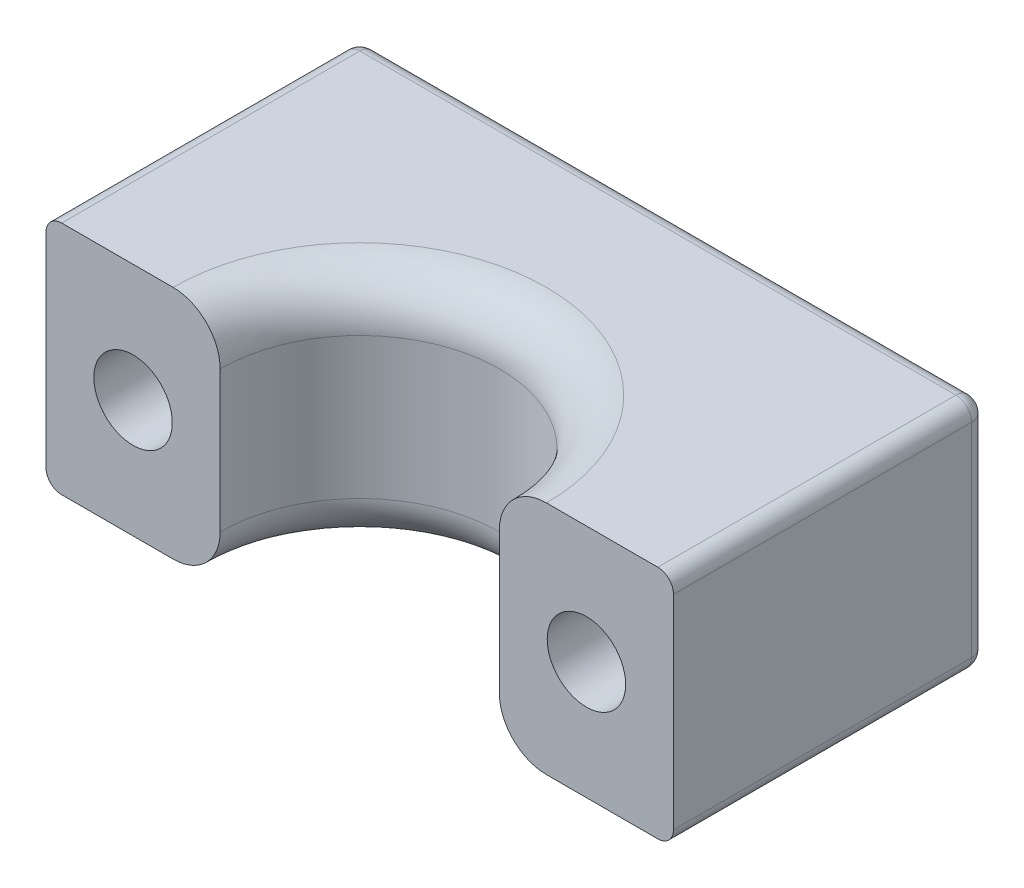
ISO-10303-21;
HEADER;
FILE_DESCRIPTION(('STEP AP214'),'2;1');
FILE_NAME('part.step','',(''),(''),'','','');
FILE_SCHEMA(('AUTOMOTIVE_DESIGN { 1 0 10303 214 1 1 1 1 }'));
ENDSEC;
DATA;
#1=APPLICATION_CONTEXT('core data for automotive mechanical design processes');
#2=APPLICATION_PROTOCOL_DEFINITION('international standard','automotive_design',2000,#1);
#3=PRODUCT_CONTEXT('',#1,'mechanical');
#4=PRODUCT('Part','Part','',(#3));
#5=PRODUCT_RELATED_PRODUCT_CATEGORY('part','',(#4));
#6=PRODUCT_DEFINITION_FORMATION('','',#4);
#7=PRODUCT_DEFINITION_CONTEXT('part definition',#1,'design');
#8=PRODUCT_DEFINITION('design','',#6,#7);
#9=PRODUCT_DEFINITION_SHAPE('','',#8);
#10=(LENGTH_UNIT() NAMED_UNIT(*) SI_UNIT(.MILLI.,.METRE.));
#11=(NAMED_UNIT(*) PLANE_ANGLE_UNIT() SI_UNIT($,.RADIAN.));
#12=(NAMED_UNIT(*) SI_UNIT($,.STERADIAN.) SOLID_ANGLE_UNIT());
#13=UNCERTAINTY_MEASURE_WITH_UNIT(LENGTH_MEASURE(1.E-05),#10,'distance_accuracy_value','');
#14=(GEOMETRIC_REPRESENTATION_CONTEXT(3) GLOBAL_UNCERTAINTY_ASSIGNED_CONTEXT((#13)) GLOBAL_UNIT_ASSIGNED_CONTEXT((#10,
#11,#12)) REPRESENTATION_CONTEXT('',''));
#15=CARTESIAN_POINT('',(0.,0.,0.));
#16=DIRECTION('',(0.,0.,1.));
#17=DIRECTION('',(1.,0.,0.));
#18=AXIS2_PLACEMENT_3D('',#15,#16,#17);
#19=CARTESIAN_POINT('',(0.,15.,0.));
#20=DIRECTION('',(1.,0.,0.));
#21=DIRECTION('',(0.,0.,-1.));
#22=AXIS2_PLACEMENT_3D('',#19,#20,#21);
#23=PLANE('',#22);
#24=DIRECTION('',(0.,-1.,0.));
#25=VECTOR('',#24,1.);
#26=CARTESIAN_POINT('',(0.,15.,-39.));
#27=LINE('',#26,#25);
#28=CARTESIAN_POINT('',(0.,14.,-39.));
#29=VERTEX_POINT('',#28);
#30=CARTESIAN_POINT('',(0.,1.,-39.));
#31=VERTEX_POINT('',#30);
#32=EDGE_CURVE('E237',#29,#31,#27,.T.);
#33=ORIENTED_EDGE('',*,*,#32,.T.);
#34=DIRECTION('',(0.,0.,1.));
#35=VECTOR('',#34,1.);
#36=CARTESIAN_POINT('',(0.,1.,-20.));
#37=LINE('',#36,#35);
#38=CARTESIAN_POINT('',(0.,1.,-20.));
#39=VERTEX_POINT('',#38);
#40=EDGE_CURVE('E240',#31,#39,#37,.T.);
#41=ORIENTED_EDGE('',*,*,#40,.T.);
#42=DIRECTION('',(0.,1.,0.));
#43=VECTOR('',#42,1.);
#44=CARTESIAN_POINT('',(0.,0.,-20.));
#45=LINE('',#44,#43);
#46=CARTESIAN_POINT('',(0.,14.,-20.));
#47=VERTEX_POINT('',#46);
#48=EDGE_CURVE('E167',#39,#47,#45,.T.);
#49=ORIENTED_EDGE('',*,*,#48,.T.);
#50=DIRECTION('',(0.,0.,1.));
#51=VECTOR('',#50,1.);
#52=CARTESIAN_POINT('',(0.,14.,0.));
#53=LINE('',#52,#51);
#54=EDGE_CURVE('E209',#47,#29,#53,.F.);
#55=ORIENTED_EDGE('',*,*,#54,.T.);
#56=EDGE_LOOP('',(#33,#41,#49,#55));
#57=FACE_BOUND('',#56,.T.);
#58=ADVANCED_FACE('F35',(#57),#23,.F.);
#59=CARTESIAN_POINT('',(40.,15.,0.));
#60=DIRECTION('',(-1.,0.,0.));
#61=DIRECTION('',(0.,0.,1.));
#62=AXIS2_PLACEMENT_3D('',#59,#60,#61);
#63=PLANE('',#62);
#64=DIRECTION('',(0.,1.,0.));
#65=VECTOR('',#64,1.);
#66=CARTESIAN_POINT('',(40.,0.,-20.));
#67=LINE('',#66,#65);
#68=CARTESIAN_POINT('',(40.,1.,-20.));
#69=VERTEX_POINT('',#68);
#70=CARTESIAN_POINT('',(40.,14.,-20.));
#71=VERTEX_POINT('',#70);
#72=EDGE_CURVE('E163',#69,#71,#67,.T.);
#73=ORIENTED_EDGE('',*,*,#72,.F.);
#74=DIRECTION('',(0.,0.,-1.));
#75=VECTOR('',#74,1.);
#76=CARTESIAN_POINT('',(40.,1.,-39.));
#77=LINE('',#76,#75);
#78=CARTESIAN_POINT('',(40.,1.,-39.));
#79=VERTEX_POINT('',#78);
#80=EDGE_CURVE('E44',#69,#79,#77,.T.);
#81=ORIENTED_EDGE('',*,*,#80,.T.);
#82=DIRECTION('',(0.,-1.,0.));
#83=VECTOR('',#82,1.);
#84=CARTESIAN_POINT('',(40.,15.,-39.));
#85=LINE('',#84,#83);
#86=CARTESIAN_POINT('',(40.,14.,-39.));
#87=VERTEX_POINT('',#86);
#88=EDGE_CURVE('E235',#79,#87,#85,.F.);
#89=ORIENTED_EDGE('',*,*,#88,.T.);
#90=DIRECTION('',(0.,0.,-1.));
#91=VECTOR('',#90,1.);
#92=CARTESIAN_POINT('',(40.,14.,0.));
#93=LINE('',#92,#91);
#94=EDGE_CURVE('E212',#87,#71,#93,.F.);
#95=ORIENTED_EDGE('',*,*,#94,.T.);
#96=EDGE_LOOP('',(#73,#81,#89,#95));
#97=FACE_BOUND('',#96,.T.);
#98=ADVANCED_FACE('F335',(#97),#63,.F.);
#99=CARTESIAN_POINT('',(0.,15.,-40.));
#100=DIRECTION('',(0.,0.,1.));
#101=DIRECTION('',(1.,0.,0.));
#102=AXIS2_PLACEMENT_3D('',#99,#100,#101);
#103=PLANE('',#102);
#104=CARTESIAN_POINT('',(34.45,7.5,-40.));
#105=DIRECTION('',(0.,0.,1.));
#106=DIRECTION('',(1.,0.,0.));
#107=AXIS2_PLACEMENT_3D('',#104,#105,#106);
#108=CIRCLE('',#107,2.5);
#109=CARTESIAN_POINT('',(36.95,7.5,-40.));
#110=VERTEX_POINT('',#109);
#111=EDGE_CURVE('E156',#110,#110,#108,.T.);
#112=ORIENTED_EDGE('',*,*,#111,.T.);
#113=EDGE_LOOP('',(#112));
#114=FACE_BOUND('',#113,.T.);
#115=CARTESIAN_POINT('',(5.55,7.5,-40.));
#116=DIRECTION('',(0.,0.,1.));
#117=DIRECTION('',(-1.,0.,0.));
#118=AXIS2_PLACEMENT_3D('',#115,#116,#117);
#119=CIRCLE('',#118,2.5);
#120=CARTESIAN_POINT('',(3.05,7.5,-40.));
#121=VERTEX_POINT('',#120);
#122=EDGE_CURVE('E179',#121,#121,#119,.T.);
#123=ORIENTED_EDGE('',*,*,#122,.T.);
#124=EDGE_LOOP('',(#123));
#125=FACE_BOUND('',#124,.T.);
#126=DIRECTION('',(0.,-1.,0.));
#127=VECTOR('',#126,1.);
#128=CARTESIAN_POINT('',(39.,15.,-40.));
#129=LINE('',#128,#127);
#130=CARTESIAN_POINT('',(39.,14.,-40.));
#131=VERTEX_POINT('',#130);
#132=CARTESIAN_POINT('',(39.,1.,-40.));
#133=VERTEX_POINT('',#132);
#134=EDGE_CURVE('E232',#131,#133,#129,.T.);
#135=ORIENTED_EDGE('',*,*,#134,.T.);
#136=DIRECTION('',(-1.,0.,0.));
#137=VECTOR('',#136,1.);
#138=CARTESIAN_POINT('',(1.,1.,-40.));
#139=LINE('',#138,#137);
#140=CARTESIAN_POINT('',(1.,1.,-40.));
#141=VERTEX_POINT('',#140);
#142=EDGE_CURVE('E256',#133,#141,#139,.T.);
#143=ORIENTED_EDGE('',*,*,#142,.T.);
#144=DIRECTION('',(0.,-1.,0.));
#145=VECTOR('',#144,1.);
#146=CARTESIAN_POINT('',(1.,15.,-40.));
#147=LINE('',#146,#145);
#148=CARTESIAN_POINT('',(1.,14.,-40.));
#149=VERTEX_POINT('',#148);
#150=EDGE_CURVE('E230',#141,#149,#147,.F.);
#151=ORIENTED_EDGE('',*,*,#150,.T.);
#152=DIRECTION('',(-1.,0.,0.));
#153=VECTOR('',#152,1.);
#154=CARTESIAN_POINT('',(0.,14.,-40.));
#155=LINE('',#154,#153);
#156=EDGE_CURVE('E217',#149,#131,#155,.F.);
#157=ORIENTED_EDGE('',*,*,#156,.T.);
#158=EDGE_LOOP('',(#135,#143,#151,#157));
#159=FACE_BOUND('',#158,.T.);
#160=ADVANCED_FACE('F318',(#114,#125,#159),#103,.F.);
#161=CARTESIAN_POINT('',(0.,15.,0.));
#162=DIRECTION('',(0.,-1.,0.));
#163=DIRECTION('',(0.,0.,-1.));
#164=AXIS2_PLACEMENT_3D('',#161,#162,#163);
#165=PLANE('',#164);
#166=DIRECTION('',(-1.,0.,0.));
#167=VECTOR('',#166,1.);
#168=CARTESIAN_POINT('',(0.,15.,-39.));
#169=LINE('',#168,#167);
#170=CARTESIAN_POINT('',(39.,15.,-39.));
#171=VERTEX_POINT('',#170);
#172=CARTESIAN_POINT('',(1.,15.,-39.));
#173=VERTEX_POINT('',#172);
#174=EDGE_CURVE('E197',#171,#173,#169,.T.);
#175=ORIENTED_EDGE('',*,*,#174,.T.);
#176=DIRECTION('',(0.,0.,1.));
#177=VECTOR('',#176,1.);
#178=CARTESIAN_POINT('',(1.,15.,0.));
#179=LINE('',#178,#177);
#180=CARTESIAN_POINT('',(1.,15.,-20.));
#181=VERTEX_POINT('',#180);
#182=EDGE_CURVE('E203',#173,#181,#179,.T.);
#183=ORIENTED_EDGE('',*,*,#182,.T.);
#184=DIRECTION('',(-1.,0.,0.));
#185=VECTOR('',#184,1.);
#186=CARTESIAN_POINT('',(0.,15.,-20.));
#187=LINE('',#186,#185);
#188=CARTESIAN_POINT('',(8.1,15.,-20.));
#189=VERTEX_POINT('',#188);
#190=EDGE_CURVE('E164',#189,#181,#187,.T.);
#191=ORIENTED_EDGE('',*,*,#190,.F.);
#192=CARTESIAN_POINT('',(20.,15.,-20.));
#193=DIRECTION('',(0.,-1.,0.));
#194=DIRECTION('',(0.,0.,-1.));
#195=AXIS2_PLACEMENT_3D('',#192,#193,#194);
#196=CIRCLE('',#195,11.9);
#197=CARTESIAN_POINT('',(31.9,15.,-20.));
#198=VERTEX_POINT('',#197);
#199=EDGE_CURVE('E194',#189,#198,#196,.T.);
#200=ORIENTED_EDGE('',*,*,#199,.T.);
#201=CARTESIAN_POINT('',(39.,15.,-20.));
#202=VERTEX_POINT('',#201);
#203=EDGE_CURVE('E161',#202,#198,#187,.T.);
#204=ORIENTED_EDGE('',*,*,#203,.F.);
#205=DIRECTION('',(0.,0.,-1.));
#206=VECTOR('',#205,1.);
#207=CARTESIAN_POINT('',(39.,15.,0.));
#208=LINE('',#207,#206);
#209=EDGE_CURVE('E200',#202,#171,#208,.T.);
#210=ORIENTED_EDGE('',*,*,#209,.T.);
#211=EDGE_LOOP('',(#175,#183,#191,#200,#204,#210));
#212=FACE_BOUND('',#211,.T.);
#213=ADVANCED_FACE('F291',(#212),#165,.F.);
#214=CARTESIAN_POINT('',(0.,0.,0.));
#215=DIRECTION('',(0.,-1.,0.));
#216=DIRECTION('',(0.,0.,-1.));
#217=AXIS2_PLACEMENT_3D('',#214,#215,#216);
#218=PLANE('',#217);
#219=DIRECTION('',(-1.,0.,0.));
#220=VECTOR('',#219,1.);
#221=CARTESIAN_POINT('',(0.,0.,-20.));
#222=LINE('',#221,#220);
#223=CARTESIAN_POINT('',(8.1,0.,-20.));
#224=VERTEX_POINT('',#223);
#225=CARTESIAN_POINT('',(1.,0.,-20.));
#226=VERTEX_POINT('',#225);
#227=EDGE_CURVE('E152',#224,#226,#222,.T.);
#228=ORIENTED_EDGE('',*,*,#227,.T.);
#229=DIRECTION('',(0.,0.,1.));
#230=VECTOR('',#229,1.);
#231=CARTESIAN_POINT('',(1.,0.,-39.));
#232=LINE('',#231,#230);
#233=CARTESIAN_POINT('',(1.,0.,-39.));
#234=VERTEX_POINT('',#233);
#235=EDGE_CURVE('E252',#226,#234,#232,.F.);
#236=ORIENTED_EDGE('',*,*,#235,.T.);
#237=DIRECTION('',(-1.,0.,0.));
#238=VECTOR('',#237,1.);
#239=CARTESIAN_POINT('',(39.,0.,-39.));
#240=LINE('',#239,#238);
#241=CARTESIAN_POINT('',(39.,0.,-39.));
#242=VERTEX_POINT('',#241);
#243=EDGE_CURVE('E250',#234,#242,#240,.F.);
#244=ORIENTED_EDGE('',*,*,#243,.T.);
#245=DIRECTION('',(0.,0.,-1.));
#246=VECTOR('',#245,1.);
#247=CARTESIAN_POINT('',(39.,0.,-20.));
#248=LINE('',#247,#246);
#249=CARTESIAN_POINT('',(39.,0.,-20.));
#250=VERTEX_POINT('',#249);
#251=EDGE_CURVE('E248',#242,#250,#248,.F.);
#252=ORIENTED_EDGE('',*,*,#251,.T.);
#253=CARTESIAN_POINT('',(31.9,0.,-20.));
#254=VERTEX_POINT('',#253);
#255=EDGE_CURVE('E154',#250,#254,#222,.T.);
#256=ORIENTED_EDGE('',*,*,#255,.T.);
#257=CARTESIAN_POINT('',(20.,0.,-20.));
#258=DIRECTION('',(0.,-1.,0.));
#259=DIRECTION('',(0.,0.,-1.));
#260=AXIS2_PLACEMENT_3D('',#257,#258,#259);
#261=CIRCLE('',#260,11.9);
#262=EDGE_CURVE('E140',#254,#224,#261,.F.);
#263=ORIENTED_EDGE('',*,*,#262,.T.);
#264=EDGE_LOOP('',(#228,#236,#244,#252,#256,#263));
#265=FACE_BOUND('',#264,.T.);
#266=ADVANCED_FACE('F151',(#265),#218,.T.);
#267=CARTESIAN_POINT('',(20.,0.,-20.));
#268=DIRECTION('',(0.,1.,0.));
#269=DIRECTION('',(0.,0.,1.));
#270=AXIS2_PLACEMENT_3D('',#267,#268,#269);
#271=CYLINDRICAL_SURFACE('',#270,8.9);
#272=DIRECTION('',(0.,1.,0.));
#273=VECTOR('',#272,1.);
#274=CARTESIAN_POINT('',(11.1,0.,-20.));
#275=LINE('',#274,#273);
#276=CARTESIAN_POINT('',(11.1,12.,-20.));
#277=VERTEX_POINT('',#276);
#278=CARTESIAN_POINT('',(11.1,3.,-20.));
#279=VERTEX_POINT('',#278);
#280=EDGE_CURVE('E177',#277,#279,#275,.F.);
#281=ORIENTED_EDGE('',*,*,#280,.T.);
#282=CARTESIAN_POINT('',(20.,3.,-20.));
#283=DIRECTION('',(0.,-1.,0.));
#284=DIRECTION('',(0.,0.,-1.));
#285=AXIS2_PLACEMENT_3D('',#282,#283,#284);
#286=CIRCLE('',#285,8.9);
#287=CARTESIAN_POINT('',(28.9,3.,-20.));
#288=VERTEX_POINT('',#287);
#289=EDGE_CURVE('E141',#279,#288,#286,.T.);
#290=ORIENTED_EDGE('',*,*,#289,.T.);
#291=DIRECTION('',(0.,1.,0.));
#292=VECTOR('',#291,1.);
#293=CARTESIAN_POINT('',(28.9,0.,-20.));
#294=LINE('',#293,#292);
#295=CARTESIAN_POINT('',(28.9,12.,-20.));
#296=VERTEX_POINT('',#295);
#297=EDGE_CURVE('E174',#288,#296,#294,.T.);
#298=ORIENTED_EDGE('',*,*,#297,.T.);
#299=CARTESIAN_POINT('',(20.,12.,-20.));
#300=DIRECTION('',(0.,-1.,0.));
#301=DIRECTION('',(0.,0.,-1.));
#302=AXIS2_PLACEMENT_3D('',#299,#300,#301);
#303=CIRCLE('',#302,8.9);
#304=EDGE_CURVE('E146',#296,#277,#303,.F.);
#305=ORIENTED_EDGE('',*,*,#304,.T.);
#306=EDGE_LOOP('',(#281,#290,#298,#305));
#307=FACE_BOUND('',#306,.T.);
#308=ADVANCED_FACE('F284',(#307),#271,.F.);
#309=CARTESIAN_POINT('',(5.55,7.5,-40.));
#310=DIRECTION('',(0.,0.,1.));
#311=DIRECTION('',(1.,0.,0.));
#312=AXIS2_PLACEMENT_3D('',#309,#310,#311);
#313=CYLINDRICAL_SURFACE('',#312,2.5);
#314=CARTESIAN_POINT('',(5.55,7.5,-20.));
#315=DIRECTION('',(0.,0.,-1.));
#316=DIRECTION('',(-1.,0.,0.));
#317=AXIS2_PLACEMENT_3D('',#314,#315,#316);
#318=CIRCLE('',#317,2.5);
#319=CARTESIAN_POINT('',(3.05,7.5,-20.));
#320=VERTEX_POINT('',#319);
#321=EDGE_CURVE('E171',#320,#320,#318,.F.);
#322=ORIENTED_EDGE('',*,*,#321,.T.);
#323=EDGE_LOOP('',(#322));
#324=FACE_BOUND('',#323,.T.);
#325=ORIENTED_EDGE('',*,*,#122,.F.);
#326=EDGE_LOOP('',(#325));
#327=FACE_BOUND('',#326,.T.);
#328=ADVANCED_FACE('F436',(#324,#327),#313,.F.);
#329=CARTESIAN_POINT('',(34.45,7.5,-40.));
#330=DIRECTION('',(0.,0.,1.));
#331=DIRECTION('',(1.,0.,0.));
#332=AXIS2_PLACEMENT_3D('',#329,#330,#331);
#333=CYLINDRICAL_SURFACE('',#332,2.5);
#334=CARTESIAN_POINT('',(34.45,7.5,-20.));
#335=DIRECTION('',(0.,0.,-1.));
#336=DIRECTION('',(-1.,0.,0.));
#337=AXIS2_PLACEMENT_3D('',#334,#335,#336);
#338=CIRCLE('',#337,2.5);
#339=CARTESIAN_POINT('',(31.95,7.5,-20.));
#340=VERTEX_POINT('',#339);
#341=EDGE_CURVE('E169',#340,#340,#338,.F.);
#342=ORIENTED_EDGE('',*,*,#341,.T.);
#343=EDGE_LOOP('',(#342));
#344=FACE_BOUND('',#343,.T.);
#345=ORIENTED_EDGE('',*,*,#111,.F.);
#346=EDGE_LOOP('',(#345));
#347=FACE_BOUND('',#346,.T.);
#348=ADVANCED_FACE('F428',(#344,#347),#333,.F.);
#349=CARTESIAN_POINT('',(0.,0.,-20.));
#350=DIRECTION('',(0.,0.,-1.));
#351=DIRECTION('',(-1.,0.,0.));
#352=AXIS2_PLACEMENT_3D('',#349,#350,#351);
#353=PLANE('',#352);
#354=ORIENTED_EDGE('',*,*,#341,.F.);
#355=EDGE_LOOP('',(#354));
#356=FACE_BOUND('',#355,.T.);
#357=ORIENTED_EDGE('',*,*,#255,.F.);
#358=CARTESIAN_POINT('',(39.,1.,-20.));
#359=DIRECTION('',(0.,0.,-1.));
#360=DIRECTION('',(-1.,0.,0.));
#361=AXIS2_PLACEMENT_3D('',#358,#359,#360);
#362=CIRCLE('',#361,1.);
#363=EDGE_CURVE('E11',#250,#69,#362,.F.);
#364=ORIENTED_EDGE('',*,*,#363,.T.);
#365=ORIENTED_EDGE('',*,*,#72,.T.);
#366=CARTESIAN_POINT('',(39.,14.,-20.));
#367=DIRECTION('',(0.,0.,-1.));
#368=DIRECTION('',(-1.,0.,0.));
#369=AXIS2_PLACEMENT_3D('',#366,#367,#368);
#370=CIRCLE('',#369,1.);
#371=EDGE_CURVE('E215',#71,#202,#370,.F.);
#372=ORIENTED_EDGE('',*,*,#371,.T.);
#373=ORIENTED_EDGE('',*,*,#203,.T.);
#374=CARTESIAN_POINT('',(31.9,12.,-20.));
#375=DIRECTION('',(0.,0.,-1.));
#376=DIRECTION('',(-1.,0.,0.));
#377=AXIS2_PLACEMENT_3D('',#374,#375,#376);
#378=CIRCLE('',#377,3.);
#379=EDGE_CURVE('E190',#198,#296,#378,.F.);
#380=ORIENTED_EDGE('',*,*,#379,.T.);
#381=ORIENTED_EDGE('',*,*,#297,.F.);
#382=CARTESIAN_POINT('',(31.9,3.,-20.));
#383=DIRECTION('',(0.,0.,-1.));
#384=DIRECTION('',(-1.,0.,0.));
#385=AXIS2_PLACEMENT_3D('',#382,#383,#384);
#386=CIRCLE('',#385,3.);
#387=EDGE_CURVE('E192',#288,#254,#386,.F.);
#388=ORIENTED_EDGE('',*,*,#387,.T.);
#389=EDGE_LOOP('',(#357,#364,#365,#372,#373,#380,#381,#388));
#390=FACE_BOUND('',#389,.T.);
#391=ADVANCED_FACE('F279',(#356,#390),#353,.F.);
#392=ORIENTED_EDGE('',*,*,#321,.F.);
#393=EDGE_LOOP('',(#392));
#394=FACE_BOUND('',#393,.T.);
#395=ORIENTED_EDGE('',*,*,#48,.F.);
#396=CARTESIAN_POINT('',(1.,1.,-20.));
#397=DIRECTION('',(0.,0.,-1.));
#398=DIRECTION('',(-1.,0.,0.));
#399=AXIS2_PLACEMENT_3D('',#396,#397,#398);
#400=CIRCLE('',#399,1.);
#401=EDGE_CURVE('E160',#39,#226,#400,.F.);
#402=ORIENTED_EDGE('',*,*,#401,.T.);
#403=ORIENTED_EDGE('',*,*,#227,.F.);
#404=CARTESIAN_POINT('',(8.1,3.,-20.));
#405=DIRECTION('',(0.,0.,-1.));
#406=DIRECTION('',(-1.,0.,0.));
#407=AXIS2_PLACEMENT_3D('',#404,#405,#406);
#408=CIRCLE('',#407,3.);
#409=EDGE_CURVE('E136',#224,#279,#408,.F.);
#410=ORIENTED_EDGE('',*,*,#409,.T.);
#411=ORIENTED_EDGE('',*,*,#280,.F.);
#412=CARTESIAN_POINT('',(8.1,12.,-20.));
#413=DIRECTION('',(0.,0.,-1.));
#414=DIRECTION('',(-1.,0.,0.));
#415=AXIS2_PLACEMENT_3D('',#412,#413,#414);
#416=CIRCLE('',#415,3.);
#417=EDGE_CURVE('E147',#277,#189,#416,.F.);
#418=ORIENTED_EDGE('',*,*,#417,.T.);
#419=ORIENTED_EDGE('',*,*,#190,.T.);
#420=CARTESIAN_POINT('',(1.,14.,-20.));
#421=DIRECTION('',(0.,0.,-1.));
#422=DIRECTION('',(-1.,0.,0.));
#423=AXIS2_PLACEMENT_3D('',#420,#421,#422);
#424=CIRCLE('',#423,1.);
#425=EDGE_CURVE('E206',#181,#47,#424,.F.);
#426=ORIENTED_EDGE('',*,*,#425,.T.);
#427=EDGE_LOOP('',(#395,#402,#403,#410,#411,#418,#419,#426));
#428=FACE_BOUND('',#427,.T.);
#429=ADVANCED_FACE('F159',(#394,#428),#353,.F.);
#430=CARTESIAN_POINT('',(20.,3.,-20.));
#431=DIRECTION('',(0.,-1.,0.));
#432=DIRECTION('',(0.,0.,-1.));
#433=AXIS2_PLACEMENT_3D('',#430,#431,#432);
#434=TOROIDAL_SURFACE('',#433,11.9,3.);
#435=ORIENTED_EDGE('',*,*,#387,.F.);
#436=ORIENTED_EDGE('',*,*,#289,.F.);
#437=ORIENTED_EDGE('',*,*,#409,.F.);
#438=ORIENTED_EDGE('',*,*,#262,.F.);
#439=EDGE_LOOP('',(#435,#436,#437,#438));
#440=FACE_BOUND('',#439,.T.);
#441=ADVANCED_FACE('F139',(#440),#434,.T.);
#442=CARTESIAN_POINT('',(20.,12.,-20.));
#443=DIRECTION('',(0.,-1.,0.));
#444=DIRECTION('',(0.,0.,-1.));
#445=AXIS2_PLACEMENT_3D('',#442,#443,#444);
#446=TOROIDAL_SURFACE('',#445,11.9,3.);
#447=ORIENTED_EDGE('',*,*,#379,.F.);
#448=ORIENTED_EDGE('',*,*,#199,.F.);
#449=ORIENTED_EDGE('',*,*,#417,.F.);
#450=ORIENTED_EDGE('',*,*,#304,.F.);
#451=EDGE_LOOP('',(#447,#448,#449,#450));
#452=FACE_BOUND('',#451,.T.);
#453=ADVANCED_FACE('F286',(#452),#446,.T.);
#454=CARTESIAN_POINT('',(39.,14.,0.));
#455=DIRECTION('',(0.,0.,-1.));
#456=DIRECTION('',(-1.,0.,0.));
#457=AXIS2_PLACEMENT_3D('',#454,#455,#456);
#458=CYLINDRICAL_SURFACE('',#457,1.);
#459=ORIENTED_EDGE('',*,*,#94,.F.);
#460=CARTESIAN_POINT('',(39.,14.,-39.));
#461=DIRECTION('',(0.,0.,-1.));
#462=DIRECTION('',(-1.,0.,0.));
#463=AXIS2_PLACEMENT_3D('',#460,#461,#462);
#464=CIRCLE('',#463,1.);
#465=EDGE_CURVE('E225',#87,#171,#464,.F.);
#466=ORIENTED_EDGE('',*,*,#465,.T.);
#467=ORIENTED_EDGE('',*,*,#209,.F.);
#468=ORIENTED_EDGE('',*,*,#371,.F.);
#469=EDGE_LOOP('',(#459,#466,#467,#468));
#470=FACE_BOUND('',#469,.T.);
#471=ADVANCED_FACE('F333',(#470),#458,.T.);
#472=CARTESIAN_POINT('',(0.,14.,-39.));
#473=DIRECTION('',(-1.,0.,0.));
#474=DIRECTION('',(0.,0.,1.));
#475=AXIS2_PLACEMENT_3D('',#472,#473,#474);
#476=CYLINDRICAL_SURFACE('',#475,1.);
#477=ORIENTED_EDGE('',*,*,#174,.F.);
#478=CARTESIAN_POINT('',(39.,14.,-39.));
#479=DIRECTION('',(-1.,0.,0.));
#480=DIRECTION('',(0.,0.,1.));
#481=AXIS2_PLACEMENT_3D('',#478,#479,#480);
#482=CIRCLE('',#481,1.);
#483=EDGE_CURVE('E222',#171,#131,#482,.T.);
#484=ORIENTED_EDGE('',*,*,#483,.T.);
#485=ORIENTED_EDGE('',*,*,#156,.F.);
#486=CARTESIAN_POINT('',(1.,14.,-39.));
#487=DIRECTION('',(-1.,0.,0.));
#488=DIRECTION('',(0.,0.,1.));
#489=AXIS2_PLACEMENT_3D('',#486,#487,#488);
#490=CIRCLE('',#489,1.);
#491=EDGE_CURVE('E220',#149,#173,#490,.F.);
#492=ORIENTED_EDGE('',*,*,#491,.T.);
#493=EDGE_LOOP('',(#477,#484,#485,#492));
#494=FACE_BOUND('',#493,.T.);
#495=ADVANCED_FACE('F326',(#494),#476,.T.);
#496=CARTESIAN_POINT('',(1.,14.,0.));
#497=DIRECTION('',(0.,0.,1.));
#498=DIRECTION('',(1.,0.,0.));
#499=AXIS2_PLACEMENT_3D('',#496,#497,#498);
#500=CYLINDRICAL_SURFACE('',#499,1.);
#501=ORIENTED_EDGE('',*,*,#182,.F.);
#502=CARTESIAN_POINT('',(1.,14.,-39.));
#503=DIRECTION('',(0.,0.,1.));
#504=DIRECTION('',(1.,0.,0.));
#505=AXIS2_PLACEMENT_3D('',#502,#503,#504);
#506=CIRCLE('',#505,1.);
#507=EDGE_CURVE('E227',#173,#29,#506,.T.);
#508=ORIENTED_EDGE('',*,*,#507,.T.);
#509=ORIENTED_EDGE('',*,*,#54,.F.);
#510=ORIENTED_EDGE('',*,*,#425,.F.);
#511=EDGE_LOOP('',(#501,#508,#509,#510));
#512=FACE_BOUND('',#511,.T.);
#513=ADVANCED_FACE('F297',(#512),#500,.T.);
#514=CARTESIAN_POINT('',(39.,15.,-39.));
#515=DIRECTION('',(0.,-1.,0.));
#516=DIRECTION('',(0.,0.,-1.));
#517=AXIS2_PLACEMENT_3D('',#514,#515,#516);
#518=CYLINDRICAL_SURFACE('',#517,1.);
#519=ORIENTED_EDGE('',*,*,#88,.F.);
#520=CARTESIAN_POINT('',(39.,1.,-39.));
#521=DIRECTION('',(0.,-1.,0.));
#522=DIRECTION('',(0.,0.,-1.));
#523=AXIS2_PLACEMENT_3D('',#520,#521,#522);
#524=CIRCLE('',#523,1.);
#525=EDGE_CURVE('E258',#79,#133,#524,.F.);
#526=ORIENTED_EDGE('',*,*,#525,.T.);
#527=ORIENTED_EDGE('',*,*,#134,.F.);
#528=CARTESIAN_POINT('',(39.,14.,-39.));
#529=DIRECTION('',(0.,1.,0.));
#530=DIRECTION('',(0.,0.,1.));
#531=AXIS2_PLACEMENT_3D('',#528,#529,#530);
#532=CIRCLE('',#531,1.);
#533=EDGE_CURVE('E241',#87,#131,#532,.T.);
#534=ORIENTED_EDGE('',*,*,#533,.F.);
#535=EDGE_LOOP('',(#519,#526,#527,#534));
#536=FACE_BOUND('',#535,.T.);
#537=ADVANCED_FACE('F323',(#536),#518,.T.);
#538=CARTESIAN_POINT('',(39.,14.,-39.));
#539=DIRECTION('',(0.,0.,1.));
#540=DIRECTION('',(1.,0.,0.));
#541=AXIS2_PLACEMENT_3D('',#538,#539,#540);
#542=SPHERICAL_SURFACE('',#541,1.);
#543=ORIENTED_EDGE('',*,*,#483,.F.);
#544=ORIENTED_EDGE('',*,*,#465,.F.);
#545=ORIENTED_EDGE('',*,*,#533,.T.);
#546=EDGE_LOOP('',(#543,#544,#545));
#547=FACE_BOUND('',#546,.T.);
#548=ADVANCED_FACE('F329',(#547),#542,.T.);
#549=CARTESIAN_POINT('',(1.,15.,-39.));
#550=DIRECTION('',(0.,-1.,0.));
#551=DIRECTION('',(0.,0.,-1.));
#552=AXIS2_PLACEMENT_3D('',#549,#550,#551);
#553=CYLINDRICAL_SURFACE('',#552,1.);
#554=ORIENTED_EDGE('',*,*,#150,.F.);
#555=CARTESIAN_POINT('',(1.,1.,-39.));
#556=DIRECTION('',(0.,-1.,0.));
#557=DIRECTION('',(0.,0.,-1.));
#558=AXIS2_PLACEMENT_3D('',#555,#556,#557);
#559=CIRCLE('',#558,1.);
#560=EDGE_CURVE('E254',#141,#31,#559,.F.);
#561=ORIENTED_EDGE('',*,*,#560,.T.);
#562=ORIENTED_EDGE('',*,*,#32,.F.);
#563=CARTESIAN_POINT('',(1.,14.,-39.));
#564=DIRECTION('',(0.,1.,0.));
#565=DIRECTION('',(0.,0.,1.));
#566=AXIS2_PLACEMENT_3D('',#563,#564,#565);
#567=CIRCLE('',#566,1.);
#568=EDGE_CURVE('E243',#149,#29,#567,.T.);
#569=ORIENTED_EDGE('',*,*,#568,.F.);
#570=EDGE_LOOP('',(#554,#561,#562,#569));
#571=FACE_BOUND('',#570,.T.);
#572=ADVANCED_FACE('F306',(#571),#553,.T.);
#573=CARTESIAN_POINT('',(1.,14.,-39.));
#574=DIRECTION('',(0.,0.,1.));
#575=DIRECTION('',(1.,0.,0.));
#576=AXIS2_PLACEMENT_3D('',#573,#574,#575);
#577=SPHERICAL_SURFACE('',#576,1.);
#578=ORIENTED_EDGE('',*,*,#507,.F.);
#579=ORIENTED_EDGE('',*,*,#491,.F.);
#580=ORIENTED_EDGE('',*,*,#568,.T.);
#581=EDGE_LOOP('',(#578,#579,#580));
#582=FACE_BOUND('',#581,.T.);
#583=ADVANCED_FACE('F301',(#582),#577,.T.);
#584=CARTESIAN_POINT('',(39.,1.,0.));
#585=DIRECTION('',(0.,0.,1.));
#586=DIRECTION('',(1.,0.,0.));
#587=AXIS2_PLACEMENT_3D('',#584,#585,#586);
#588=CYLINDRICAL_SURFACE('',#587,1.);
#589=CARTESIAN_POINT('',(39.,1.,-39.));
#590=DIRECTION('',(0.,0.,-1.));
#591=DIRECTION('',(-1.,0.,0.));
#592=AXIS2_PLACEMENT_3D('',#589,#590,#591);
#593=CIRCLE('',#592,1.);
#594=EDGE_CURVE('E39',#79,#242,#593,.T.);
#595=ORIENTED_EDGE('',*,*,#594,.F.);
#596=ORIENTED_EDGE('',*,*,#80,.F.);
#597=ORIENTED_EDGE('',*,*,#363,.F.);
#598=ORIENTED_EDGE('',*,*,#251,.F.);
#599=EDGE_LOOP('',(#595,#596,#597,#598));
#600=FACE_BOUND('',#599,.T.);
#601=ADVANCED_FACE('F37',(#600),#588,.T.);
#602=CARTESIAN_POINT('',(39.,1.,-39.));
#603=DIRECTION('',(0.,-1.,0.));
#604=DIRECTION('',(0.,0.,-1.));
#605=AXIS2_PLACEMENT_3D('',#602,#603,#604);
#606=SPHERICAL_SURFACE('',#605,1.);
#607=ORIENTED_EDGE('',*,*,#525,.F.);
#608=ORIENTED_EDGE('',*,*,#594,.T.);
#609=CARTESIAN_POINT('',(39.,1.,-39.));
#610=DIRECTION('',(-1.,0.,0.));
#611=DIRECTION('',(0.,0.,1.));
#612=AXIS2_PLACEMENT_3D('',#609,#610,#611);
#613=CIRCLE('',#612,1.);
#614=EDGE_CURVE('E266',#133,#242,#613,.T.);
#615=ORIENTED_EDGE('',*,*,#614,.F.);
#616=EDGE_LOOP('',(#607,#608,#615));
#617=FACE_BOUND('',#616,.T.);
#618=ADVANCED_FACE('F276',(#617),#606,.T.);
#619=CARTESIAN_POINT('',(0.,1.,-39.));
#620=DIRECTION('',(1.,0.,0.));
#621=DIRECTION('',(0.,0.,-1.));
#622=AXIS2_PLACEMENT_3D('',#619,#620,#621);
#623=CYLINDRICAL_SURFACE('',#622,1.);
#624=CARTESIAN_POINT('',(1.,1.,-39.));
#625=DIRECTION('',(-1.,0.,0.));
#626=DIRECTION('',(0.,0.,1.));
#627=AXIS2_PLACEMENT_3D('',#624,#625,#626);
#628=CIRCLE('',#627,1.);
#629=EDGE_CURVE('E264',#141,#234,#628,.T.);
#630=ORIENTED_EDGE('',*,*,#629,.F.);
#631=ORIENTED_EDGE('',*,*,#142,.F.);
#632=ORIENTED_EDGE('',*,*,#614,.T.);
#633=ORIENTED_EDGE('',*,*,#243,.F.);
#634=EDGE_LOOP('',(#630,#631,#632,#633));
#635=FACE_BOUND('',#634,.T.);
#636=ADVANCED_FACE('F316',(#635),#623,.T.);
#637=CARTESIAN_POINT('',(1.,1.,-39.));
#638=DIRECTION('',(0.,-1.,0.));
#639=DIRECTION('',(0.,0.,-1.));
#640=AXIS2_PLACEMENT_3D('',#637,#638,#639);
#641=SPHERICAL_SURFACE('',#640,1.);
#642=ORIENTED_EDGE('',*,*,#560,.F.);
#643=ORIENTED_EDGE('',*,*,#629,.T.);
#644=CARTESIAN_POINT('',(1.,1.,-39.));
#645=DIRECTION('',(0.,0.,1.));
#646=DIRECTION('',(1.,0.,0.));
#647=AXIS2_PLACEMENT_3D('',#644,#645,#646);
#648=CIRCLE('',#647,1.);
#649=EDGE_CURVE('E261',#31,#234,#648,.T.);
#650=ORIENTED_EDGE('',*,*,#649,.F.);
#651=EDGE_LOOP('',(#642,#643,#650));
#652=FACE_BOUND('',#651,.T.);
#653=ADVANCED_FACE('F312',(#652),#641,.T.);
#654=CARTESIAN_POINT('',(1.,1.,0.));
#655=DIRECTION('',(0.,0.,-1.));
#656=DIRECTION('',(-1.,0.,0.));
#657=AXIS2_PLACEMENT_3D('',#654,#655,#656);
#658=CYLINDRICAL_SURFACE('',#657,1.);
#659=ORIENTED_EDGE('',*,*,#649,.T.);
#660=ORIENTED_EDGE('',*,*,#235,.F.);
#661=ORIENTED_EDGE('',*,*,#401,.F.);
#662=ORIENTED_EDGE('',*,*,#40,.F.);
#663=EDGE_LOOP('',(#659,#660,#661,#662));
#664=FACE_BOUND('',#663,.T.);
#665=ADVANCED_FACE('F315',(#664),#658,.T.);
#666=CLOSED_SHELL('',(#58,#98,#160,#213,#266,#308,#328,#348,#391,#429,#441,#453,#471,#495,#513,
#537,#548,#572,#583,#601,#618,#636,#653,#665));
#667=MANIFOLD_SOLID_BREP('B2',#666);
#668=ADVANCED_BREP_SHAPE_REPRESENTATION('',(#18,#667),#14);
#669=SHAPE_DEFINITION_REPRESENTATION(#9,#668);
ENDSEC;
END-ISO-10303-21;
